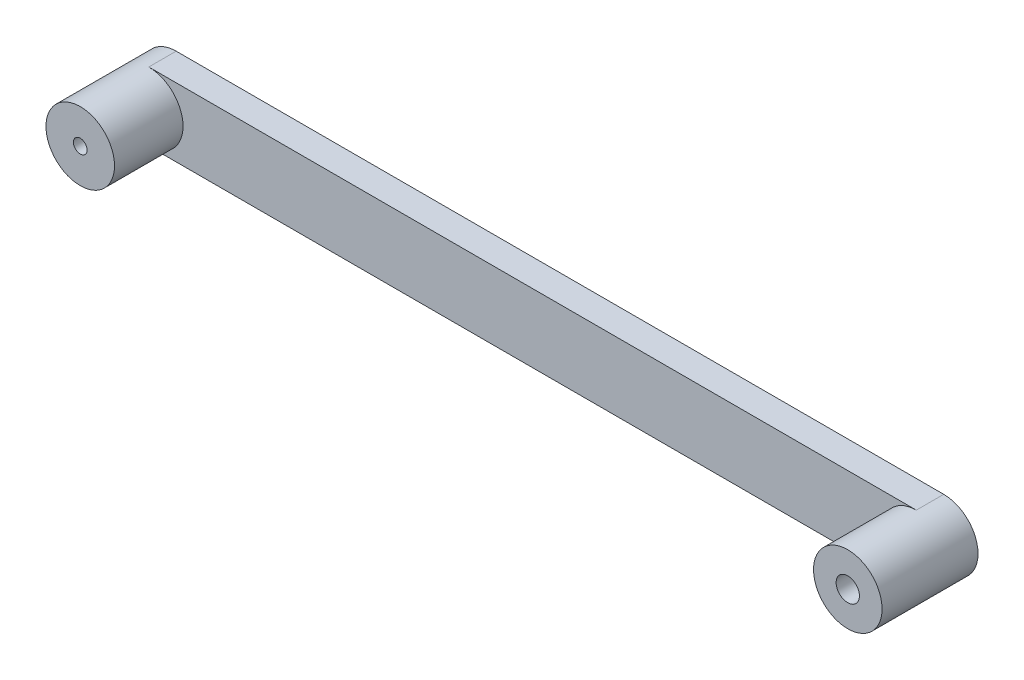
ISO-10303-21;
HEADER;
FILE_DESCRIPTION(('STEP AP214'),'2;1');
FILE_NAME('part.step','',(''),(''),'','','');
FILE_SCHEMA(('AUTOMOTIVE_DESIGN { 1 0 10303 214 1 1 1 1 }'));
ENDSEC;
DATA;
#1=APPLICATION_CONTEXT('core data for automotive mechanical design processes');
#2=APPLICATION_PROTOCOL_DEFINITION('international standard','automotive_design',2000,#1);
#3=PRODUCT_CONTEXT('',#1,'mechanical');
#4=PRODUCT('Part','Part','',(#3));
#5=PRODUCT_RELATED_PRODUCT_CATEGORY('part','',(#4));
#6=PRODUCT_DEFINITION_FORMATION('','',#4);
#7=PRODUCT_DEFINITION_CONTEXT('part definition',#1,'design');
#8=PRODUCT_DEFINITION('design','',#6,#7);
#9=PRODUCT_DEFINITION_SHAPE('','',#8);
#10=(LENGTH_UNIT() NAMED_UNIT(*) SI_UNIT(.MILLI.,.METRE.));
#11=(NAMED_UNIT(*) PLANE_ANGLE_UNIT() SI_UNIT($,.RADIAN.));
#12=(NAMED_UNIT(*) SI_UNIT($,.STERADIAN.) SOLID_ANGLE_UNIT());
#13=UNCERTAINTY_MEASURE_WITH_UNIT(LENGTH_MEASURE(1.E-05),#10,'distance_accuracy_value','');
#14=(GEOMETRIC_REPRESENTATION_CONTEXT(3) GLOBAL_UNCERTAINTY_ASSIGNED_CONTEXT((#13)) GLOBAL_UNIT_ASSIGNED_CONTEXT((#10,
#11,#12)) REPRESENTATION_CONTEXT('',''));
#15=CARTESIAN_POINT('',(0.,0.,0.));
#16=DIRECTION('',(0.,0.,1.));
#17=DIRECTION('',(1.,0.,0.));
#18=AXIS2_PLACEMENT_3D('',#15,#16,#17);
#19=CARTESIAN_POINT('',(-28.,0.,2.));
#20=DIRECTION('',(0.,0.,-1.));
#21=DIRECTION('',(-1.,0.,0.));
#22=AXIS2_PLACEMENT_3D('',#19,#20,#21);
#23=CYLINDRICAL_SURFACE('',#22,2.5);
#24=CARTESIAN_POINT('',(-28.,0.,0.));
#25=DIRECTION('',(0.,0.,1.));
#26=DIRECTION('',(1.,0.,0.));
#27=AXIS2_PLACEMENT_3D('',#24,#25,#26);
#28=CIRCLE('',#27,2.5);
#29=CARTESIAN_POINT('',(-28.,2.5,0.));
#30=VERTEX_POINT('',#29);
#31=CARTESIAN_POINT('',(-28.,-2.5,0.));
#32=VERTEX_POINT('',#31);
#33=EDGE_CURVE('E86',#30,#32,#28,.T.);
#34=ORIENTED_EDGE('',*,*,#33,.T.);
#35=DIRECTION('',(0.,0.,-1.));
#36=VECTOR('',#35,1.);
#37=CARTESIAN_POINT('',(-28.,-2.5,2.));
#38=LINE('',#37,#36);
#39=CARTESIAN_POINT('',(-28.,-2.5,2.));
#40=VERTEX_POINT('',#39);
#41=EDGE_CURVE('E41',#40,#32,#38,.T.);
#42=ORIENTED_EDGE('',*,*,#41,.F.);
#43=CARTESIAN_POINT('',(-28.,0.,2.));
#44=DIRECTION('',(0.,0.,1.));
#45=DIRECTION('',(1.,0.,0.));
#46=AXIS2_PLACEMENT_3D('',#43,#44,#45);
#47=CIRCLE('',#46,2.5);
#48=CARTESIAN_POINT('',(-28.,2.5,2.));
#49=VERTEX_POINT('',#48);
#50=EDGE_CURVE('E11',#49,#40,#47,.F.);
#51=ORIENTED_EDGE('',*,*,#50,.F.);
#52=DIRECTION('',(0.,0.,-1.));
#53=VECTOR('',#52,1.);
#54=CARTESIAN_POINT('',(-28.,2.5,2.));
#55=LINE('',#54,#53);
#56=EDGE_CURVE('E76',#49,#30,#55,.T.);
#57=ORIENTED_EDGE('',*,*,#56,.T.);
#58=EDGE_LOOP('',(#34,#42,#51,#57));
#59=FACE_BOUND('',#58,.T.);
#60=CARTESIAN_POINT('',(-28.,0.,7.));
#61=DIRECTION('',(0.,0.,1.));
#62=DIRECTION('',(1.,0.,0.));
#63=AXIS2_PLACEMENT_3D('',#60,#61,#62);
#64=CIRCLE('',#63,2.5);
#65=CARTESIAN_POINT('',(-25.5,0.,7.));
#66=VERTEX_POINT('',#65);
#67=EDGE_CURVE('E109',#66,#66,#64,.T.);
#68=ORIENTED_EDGE('',*,*,#67,.F.);
#69=EDGE_LOOP('',(#68));
#70=FACE_BOUND('',#69,.T.);
#71=ADVANCED_FACE('F33',(#59,#70),#23,.T.);
#72=CARTESIAN_POINT('',(-28.,-2.5,2.));
#73=DIRECTION('',(0.,1.,0.));
#74=DIRECTION('',(-1.,0.,0.));
#75=AXIS2_PLACEMENT_3D('',#72,#73,#74);
#76=PLANE('',#75);
#77=DIRECTION('',(1.,0.,0.));
#78=VECTOR('',#77,1.);
#79=CARTESIAN_POINT('',(-28.,-2.5,0.));
#80=LINE('',#79,#78);
#81=CARTESIAN_POINT('',(28.,-2.49999999999999,0.));
#82=VERTEX_POINT('',#81);
#83=EDGE_CURVE('E91',#32,#82,#80,.T.);
#84=ORIENTED_EDGE('',*,*,#83,.T.);
#85=DIRECTION('',(0.,0.,-1.));
#86=VECTOR('',#85,1.);
#87=CARTESIAN_POINT('',(28.,-2.49999999999999,2.));
#88=LINE('',#87,#86);
#89=CARTESIAN_POINT('',(28.,-2.49999999999999,2.));
#90=VERTEX_POINT('',#89);
#91=EDGE_CURVE('E104',#90,#82,#88,.T.);
#92=ORIENTED_EDGE('',*,*,#91,.F.);
#93=DIRECTION('',(1.,0.,0.));
#94=VECTOR('',#93,1.);
#95=CARTESIAN_POINT('',(-28.,-2.5,2.));
#96=LINE('',#95,#94);
#97=EDGE_CURVE('E48',#40,#90,#96,.T.);
#98=ORIENTED_EDGE('',*,*,#97,.F.);
#99=ORIENTED_EDGE('',*,*,#41,.T.);
#100=EDGE_LOOP('',(#84,#92,#98,#99));
#101=FACE_BOUND('',#100,.T.);
#102=ADVANCED_FACE('F106',(#101),#76,.F.);
#103=CARTESIAN_POINT('',(28.,0.,2.));
#104=DIRECTION('',(0.,0.,-1.));
#105=DIRECTION('',(-1.,0.,0.));
#106=AXIS2_PLACEMENT_3D('',#103,#104,#105);
#107=CYLINDRICAL_SURFACE('',#106,2.5);
#108=CARTESIAN_POINT('',(28.,0.,0.));
#109=DIRECTION('',(0.,0.,1.));
#110=DIRECTION('',(1.,0.,0.));
#111=AXIS2_PLACEMENT_3D('',#108,#109,#110);
#112=CIRCLE('',#111,2.5);
#113=CARTESIAN_POINT('',(28.,2.50000000000001,0.));
#114=VERTEX_POINT('',#113);
#115=EDGE_CURVE('E65',#82,#114,#112,.T.);
#116=ORIENTED_EDGE('',*,*,#115,.T.);
#117=DIRECTION('',(0.,0.,-1.));
#118=VECTOR('',#117,1.);
#119=CARTESIAN_POINT('',(28.,2.50000000000001,2.));
#120=LINE('',#119,#118);
#121=CARTESIAN_POINT('',(28.,2.50000000000001,2.));
#122=VERTEX_POINT('',#121);
#123=EDGE_CURVE('E77',#122,#114,#120,.T.);
#124=ORIENTED_EDGE('',*,*,#123,.F.);
#125=CARTESIAN_POINT('',(28.,0.,2.));
#126=DIRECTION('',(0.,0.,1.));
#127=DIRECTION('',(1.,0.,0.));
#128=AXIS2_PLACEMENT_3D('',#125,#126,#127);
#129=CIRCLE('',#128,2.5);
#130=EDGE_CURVE('E97',#122,#90,#129,.T.);
#131=ORIENTED_EDGE('',*,*,#130,.T.);
#132=ORIENTED_EDGE('',*,*,#91,.T.);
#133=EDGE_LOOP('',(#116,#124,#131,#132));
#134=FACE_BOUND('',#133,.T.);
#135=CARTESIAN_POINT('',(28.,0.,7.));
#136=DIRECTION('',(0.,0.,1.));
#137=DIRECTION('',(1.,0.,0.));
#138=AXIS2_PLACEMENT_3D('',#135,#136,#137);
#139=CIRCLE('',#138,2.5);
#140=CARTESIAN_POINT('',(30.5,0.,7.));
#141=VERTEX_POINT('',#140);
#142=EDGE_CURVE('E93',#141,#141,#139,.T.);
#143=ORIENTED_EDGE('',*,*,#142,.F.);
#144=EDGE_LOOP('',(#143));
#145=FACE_BOUND('',#144,.T.);
#146=ADVANCED_FACE('F142',(#134,#145),#107,.T.);
#147=CARTESIAN_POINT('',(-28.,2.5,2.));
#148=DIRECTION('',(0.,-1.,0.));
#149=DIRECTION('',(1.,0.,0.));
#150=AXIS2_PLACEMENT_3D('',#147,#148,#149);
#151=PLANE('',#150);
#152=DIRECTION('',(-1.,0.,0.));
#153=VECTOR('',#152,1.);
#154=CARTESIAN_POINT('',(-28.,2.5,0.));
#155=LINE('',#154,#153);
#156=EDGE_CURVE('E71',#114,#30,#155,.T.);
#157=ORIENTED_EDGE('',*,*,#156,.T.);
#158=ORIENTED_EDGE('',*,*,#56,.F.);
#159=DIRECTION('',(-1.,0.,0.));
#160=VECTOR('',#159,1.);
#161=CARTESIAN_POINT('',(-28.,2.5,2.));
#162=LINE('',#161,#160);
#163=EDGE_CURVE('E88',#122,#49,#162,.T.);
#164=ORIENTED_EDGE('',*,*,#163,.F.);
#165=ORIENTED_EDGE('',*,*,#123,.T.);
#166=EDGE_LOOP('',(#157,#158,#164,#165));
#167=FACE_BOUND('',#166,.T.);
#168=ADVANCED_FACE('F73',(#167),#151,.F.);
#169=CARTESIAN_POINT('',(-28.,0.,2.));
#170=DIRECTION('',(0.,0.,1.));
#171=DIRECTION('',(1.,0.,0.));
#172=AXIS2_PLACEMENT_3D('',#169,#170,#171);
#173=PLANE('',#172);
#174=ORIENTED_EDGE('',*,*,#163,.T.);
#175=ORIENTED_EDGE('',*,*,#50,.T.);
#176=ORIENTED_EDGE('',*,*,#97,.T.);
#177=ORIENTED_EDGE('',*,*,#130,.F.);
#178=EDGE_LOOP('',(#174,#175,#176,#177));
#179=FACE_BOUND('',#178,.T.);
#180=ADVANCED_FACE('F149',(#179),#173,.T.);
#181=CARTESIAN_POINT('',(-28.,0.,0.));
#182=DIRECTION('',(0.,0.,1.));
#183=DIRECTION('',(1.,0.,0.));
#184=AXIS2_PLACEMENT_3D('',#181,#182,#183);
#185=PLANE('',#184);
#186=CARTESIAN_POINT('',(28.,0.,0.));
#187=DIRECTION('',(0.,0.,1.));
#188=DIRECTION('',(1.,0.,0.));
#189=AXIS2_PLACEMENT_3D('',#186,#187,#188);
#190=CIRCLE('',#189,0.85);
#191=CARTESIAN_POINT('',(28.85,0.,0.));
#192=VERTEX_POINT('',#191);
#193=EDGE_CURVE('E117',#192,#192,#190,.T.);
#194=ORIENTED_EDGE('',*,*,#193,.T.);
#195=EDGE_LOOP('',(#194));
#196=FACE_BOUND('',#195,.T.);
#197=CARTESIAN_POINT('',(-28.,0.,0.));
#198=DIRECTION('',(0.,0.,1.));
#199=DIRECTION('',(1.,0.,0.));
#200=AXIS2_PLACEMENT_3D('',#197,#198,#199);
#201=CIRCLE('',#200,0.499999999999999);
#202=CARTESIAN_POINT('',(-27.5,0.,0.));
#203=VERTEX_POINT('',#202);
#204=EDGE_CURVE('E113',#203,#203,#201,.T.);
#205=ORIENTED_EDGE('',*,*,#204,.T.);
#206=EDGE_LOOP('',(#205));
#207=FACE_BOUND('',#206,.T.);
#208=ORIENTED_EDGE('',*,*,#33,.F.);
#209=ORIENTED_EDGE('',*,*,#156,.F.);
#210=ORIENTED_EDGE('',*,*,#115,.F.);
#211=ORIENTED_EDGE('',*,*,#83,.F.);
#212=EDGE_LOOP('',(#208,#209,#210,#211));
#213=FACE_BOUND('',#212,.T.);
#214=ADVANCED_FACE('F90',(#196,#207,#213),#185,.F.);
#215=CARTESIAN_POINT('',(28.,0.,7.));
#216=DIRECTION('',(0.,0.,1.));
#217=DIRECTION('',(1.,0.,0.));
#218=AXIS2_PLACEMENT_3D('',#215,#216,#217);
#219=PLANE('',#218);
#220=CARTESIAN_POINT('',(28.,0.,7.));
#221=DIRECTION('',(0.,0.,1.));
#222=DIRECTION('',(1.,0.,0.));
#223=AXIS2_PLACEMENT_3D('',#220,#221,#222);
#224=CIRCLE('',#223,0.85);
#225=CARTESIAN_POINT('',(28.85,0.,7.));
#226=VERTEX_POINT('',#225);
#227=EDGE_CURVE('E120',#226,#226,#224,.T.);
#228=ORIENTED_EDGE('',*,*,#227,.F.);
#229=EDGE_LOOP('',(#228));
#230=FACE_BOUND('',#229,.T.);
#231=ORIENTED_EDGE('',*,*,#142,.T.);
#232=EDGE_LOOP('',(#231));
#233=FACE_BOUND('',#232,.T.);
#234=ADVANCED_FACE('F135',(#230,#233),#219,.T.);
#235=CARTESIAN_POINT('',(-28.,0.,7.));
#236=DIRECTION('',(0.,0.,1.));
#237=DIRECTION('',(1.,0.,0.));
#238=AXIS2_PLACEMENT_3D('',#235,#236,#237);
#239=PLANE('',#238);
#240=CARTESIAN_POINT('',(-28.,0.,7.));
#241=DIRECTION('',(0.,0.,1.));
#242=DIRECTION('',(1.,0.,0.));
#243=AXIS2_PLACEMENT_3D('',#240,#241,#242);
#244=CIRCLE('',#243,0.499999999999999);
#245=CARTESIAN_POINT('',(-27.5,0.,7.));
#246=VERTEX_POINT('',#245);
#247=EDGE_CURVE('E114',#246,#246,#244,.T.);
#248=ORIENTED_EDGE('',*,*,#247,.F.);
#249=EDGE_LOOP('',(#248));
#250=FACE_BOUND('',#249,.T.);
#251=ORIENTED_EDGE('',*,*,#67,.T.);
#252=EDGE_LOOP('',(#251));
#253=FACE_BOUND('',#252,.T.);
#254=ADVANCED_FACE('F138',(#250,#253),#239,.T.);
#255=CARTESIAN_POINT('',(-28.,0.,0.));
#256=DIRECTION('',(0.,0.,1.));
#257=DIRECTION('',(1.,0.,0.));
#258=AXIS2_PLACEMENT_3D('',#255,#256,#257);
#259=CYLINDRICAL_SURFACE('',#258,0.499999999999999);
#260=ORIENTED_EDGE('',*,*,#204,.F.);
#261=EDGE_LOOP('',(#260));
#262=FACE_BOUND('',#261,.T.);
#263=ORIENTED_EDGE('',*,*,#247,.T.);
#264=EDGE_LOOP('',(#263));
#265=FACE_BOUND('',#264,.T.);
#266=ADVANCED_FACE('F131',(#262,#265),#259,.F.);
#267=CARTESIAN_POINT('',(28.,0.,0.));
#268=DIRECTION('',(0.,0.,1.));
#269=DIRECTION('',(1.,0.,0.));
#270=AXIS2_PLACEMENT_3D('',#267,#268,#269);
#271=CYLINDRICAL_SURFACE('',#270,0.85);
#272=ORIENTED_EDGE('',*,*,#193,.F.);
#273=EDGE_LOOP('',(#272));
#274=FACE_BOUND('',#273,.T.);
#275=ORIENTED_EDGE('',*,*,#227,.T.);
#276=EDGE_LOOP('',(#275));
#277=FACE_BOUND('',#276,.T.);
#278=ADVANCED_FACE('F128',(#274,#277),#271,.F.);
#279=CLOSED_SHELL('',(#71,#102,#146,#168,#180,#214,#234,#254,#266,#278));
#280=MANIFOLD_SOLID_BREP('B2',#279);
#281=ADVANCED_BREP_SHAPE_REPRESENTATION('',(#18,#280),#14);
#282=SHAPE_DEFINITION_REPRESENTATION(#9,#281);
ENDSEC;
END-ISO-10303-21;
